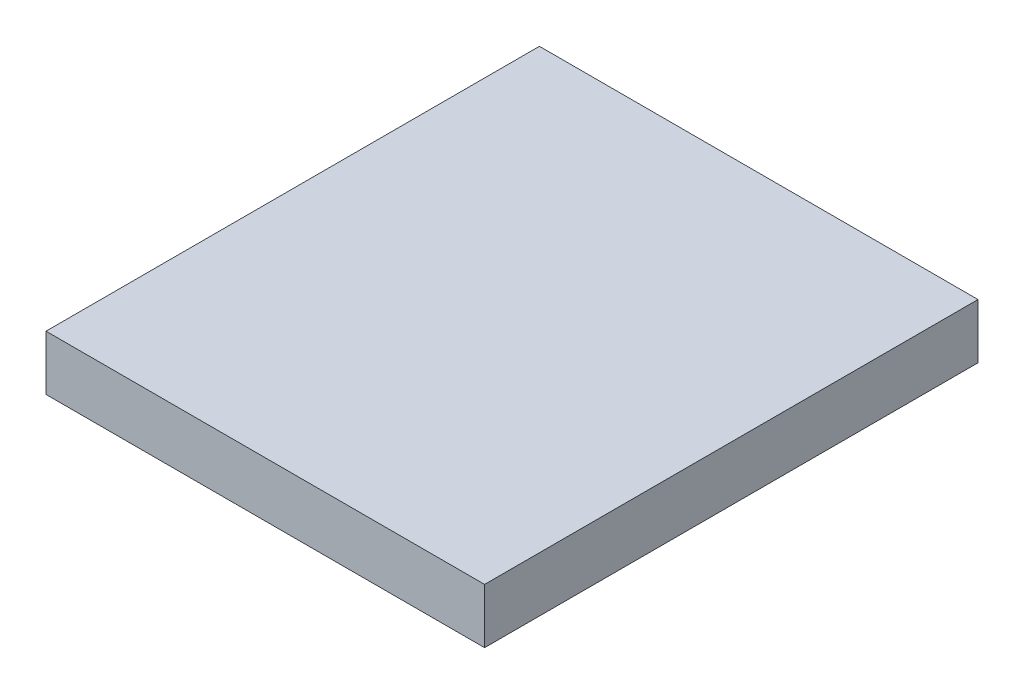
ISO-10303-21;
HEADER;
FILE_DESCRIPTION(('STEP AP214'),'2;1');
FILE_NAME('part.step','',(''),(''),'','','');
FILE_SCHEMA(('AUTOMOTIVE_DESIGN { 1 0 10303 214 1 1 1 1 }'));
ENDSEC;
DATA;
#1=APPLICATION_CONTEXT('core data for automotive mechanical design processes');
#2=APPLICATION_PROTOCOL_DEFINITION('international standard','automotive_design',2000,#1);
#3=PRODUCT_CONTEXT('',#1,'mechanical');
#4=PRODUCT('Part','Part','',(#3));
#5=PRODUCT_RELATED_PRODUCT_CATEGORY('part','',(#4));
#6=PRODUCT_DEFINITION_FORMATION('','',#4);
#7=PRODUCT_DEFINITION_CONTEXT('part definition',#1,'design');
#8=PRODUCT_DEFINITION('design','',#6,#7);
#9=PRODUCT_DEFINITION_SHAPE('','',#8);
#10=(LENGTH_UNIT() NAMED_UNIT(*) SI_UNIT(.MILLI.,.METRE.));
#11=(NAMED_UNIT(*) PLANE_ANGLE_UNIT() SI_UNIT($,.RADIAN.));
#12=(NAMED_UNIT(*) SI_UNIT($,.STERADIAN.) SOLID_ANGLE_UNIT());
#13=UNCERTAINTY_MEASURE_WITH_UNIT(LENGTH_MEASURE(1.E-05),#10,'distance_accuracy_value','');
#14=(GEOMETRIC_REPRESENTATION_CONTEXT(3) GLOBAL_UNCERTAINTY_ASSIGNED_CONTEXT((#13)) GLOBAL_UNIT_ASSIGNED_CONTEXT((#10,
#11,#12)) REPRESENTATION_CONTEXT('',''));
#15=CARTESIAN_POINT('',(0.,0.,0.));
#16=DIRECTION('',(0.,0.,1.));
#17=DIRECTION('',(1.,0.,0.));
#18=AXIS2_PLACEMENT_3D('',#15,#16,#17);
#19=CARTESIAN_POINT('',(8.,2.,-9.));
#20=DIRECTION('',(-1.,0.,0.));
#21=DIRECTION('',(0.,0.,1.));
#22=AXIS2_PLACEMENT_3D('',#19,#20,#21);
#23=PLANE('',#22);
#24=DIRECTION('',(0.,0.,-1.));
#25=VECTOR('',#24,1.);
#26=CARTESIAN_POINT('',(8.,0.,-9.));
#27=LINE('',#26,#25);
#28=CARTESIAN_POINT('',(8.,0.,9.));
#29=VERTEX_POINT('',#28);
#30=CARTESIAN_POINT('',(8.,0.,-9.));
#31=VERTEX_POINT('',#30);
#32=EDGE_CURVE('E96',#29,#31,#27,.T.);
#33=ORIENTED_EDGE('',*,*,#32,.T.);
#34=DIRECTION('',(0.,-1.,0.));
#35=VECTOR('',#34,1.);
#36=CARTESIAN_POINT('',(8.,2.,-9.));
#37=LINE('',#36,#35);
#38=CARTESIAN_POINT('',(8.,2.,-9.));
#39=VERTEX_POINT('',#38);
#40=EDGE_CURVE('E11',#39,#31,#37,.T.);
#41=ORIENTED_EDGE('',*,*,#40,.F.);
#42=DIRECTION('',(0.,0.,-1.));
#43=VECTOR('',#42,1.);
#44=CARTESIAN_POINT('',(8.,2.,-9.));
#45=LINE('',#44,#43);
#46=CARTESIAN_POINT('',(8.,2.,9.));
#47=VERTEX_POINT('',#46);
#48=EDGE_CURVE('E84',#47,#39,#45,.T.);
#49=ORIENTED_EDGE('',*,*,#48,.F.);
#50=DIRECTION('',(0.,-1.,0.));
#51=VECTOR('',#50,1.);
#52=CARTESIAN_POINT('',(8.,2.,9.));
#53=LINE('',#52,#51);
#54=EDGE_CURVE('E92',#47,#29,#53,.T.);
#55=ORIENTED_EDGE('',*,*,#54,.T.);
#56=EDGE_LOOP('',(#33,#41,#49,#55));
#57=FACE_BOUND('',#56,.T.);
#58=ADVANCED_FACE('F33',(#57),#23,.F.);
#59=CARTESIAN_POINT('',(-8.,2.,-9.));
#60=DIRECTION('',(0.,0.,1.));
#61=DIRECTION('',(1.,0.,0.));
#62=AXIS2_PLACEMENT_3D('',#59,#60,#61);
#63=PLANE('',#62);
#64=DIRECTION('',(-1.,0.,0.));
#65=VECTOR('',#64,1.);
#66=CARTESIAN_POINT('',(-8.,0.,-9.));
#67=LINE('',#66,#65);
#68=CARTESIAN_POINT('',(-8.,0.,-9.));
#69=VERTEX_POINT('',#68);
#70=EDGE_CURVE('E88',#31,#69,#67,.T.);
#71=ORIENTED_EDGE('',*,*,#70,.T.);
#72=DIRECTION('',(0.,-1.,0.));
#73=VECTOR('',#72,1.);
#74=CARTESIAN_POINT('',(-8.,2.,-9.));
#75=LINE('',#74,#73);
#76=CARTESIAN_POINT('',(-8.,2.,-9.));
#77=VERTEX_POINT('',#76);
#78=EDGE_CURVE('E41',#77,#69,#75,.T.);
#79=ORIENTED_EDGE('',*,*,#78,.F.);
#80=DIRECTION('',(-1.,0.,0.));
#81=VECTOR('',#80,1.);
#82=CARTESIAN_POINT('',(-8.,2.,-9.));
#83=LINE('',#82,#81);
#84=EDGE_CURVE('E79',#39,#77,#83,.T.);
#85=ORIENTED_EDGE('',*,*,#84,.F.);
#86=ORIENTED_EDGE('',*,*,#40,.T.);
#87=EDGE_LOOP('',(#71,#79,#85,#86));
#88=FACE_BOUND('',#87,.T.);
#89=ADVANCED_FACE('F87',(#88),#63,.F.);
#90=CARTESIAN_POINT('',(-8.,2.,-9.));
#91=DIRECTION('',(1.,0.,0.));
#92=DIRECTION('',(0.,0.,-1.));
#93=AXIS2_PLACEMENT_3D('',#90,#91,#92);
#94=PLANE('',#93);
#95=DIRECTION('',(0.,0.,1.));
#96=VECTOR('',#95,1.);
#97=CARTESIAN_POINT('',(-8.,0.,-9.));
#98=LINE('',#97,#96);
#99=CARTESIAN_POINT('',(-8.,0.,9.));
#100=VERTEX_POINT('',#99);
#101=EDGE_CURVE('E66',#69,#100,#98,.T.);
#102=ORIENTED_EDGE('',*,*,#101,.T.);
#103=DIRECTION('',(0.,-1.,0.));
#104=VECTOR('',#103,1.);
#105=CARTESIAN_POINT('',(-8.,2.,9.));
#106=LINE('',#105,#104);
#107=CARTESIAN_POINT('',(-8.,2.,9.));
#108=VERTEX_POINT('',#107);
#109=EDGE_CURVE('E89',#108,#100,#106,.T.);
#110=ORIENTED_EDGE('',*,*,#109,.F.);
#111=DIRECTION('',(0.,0.,1.));
#112=VECTOR('',#111,1.);
#113=CARTESIAN_POINT('',(-8.,2.,-9.));
#114=LINE('',#113,#112);
#115=EDGE_CURVE('E82',#77,#108,#114,.T.);
#116=ORIENTED_EDGE('',*,*,#115,.F.);
#117=ORIENTED_EDGE('',*,*,#78,.T.);
#118=EDGE_LOOP('',(#102,#110,#116,#117));
#119=FACE_BOUND('',#118,.T.);
#120=ADVANCED_FACE('F90',(#119),#94,.F.);
#121=CARTESIAN_POINT('',(-8.,2.,9.));
#122=DIRECTION('',(0.,0.,-1.));
#123=DIRECTION('',(-1.,0.,0.));
#124=AXIS2_PLACEMENT_3D('',#121,#122,#123);
#125=PLANE('',#124);
#126=DIRECTION('',(1.,0.,0.));
#127=VECTOR('',#126,1.);
#128=CARTESIAN_POINT('',(-8.,0.,9.));
#129=LINE('',#128,#127);
#130=EDGE_CURVE('E72',#100,#29,#129,.T.);
#131=ORIENTED_EDGE('',*,*,#130,.T.);
#132=ORIENTED_EDGE('',*,*,#54,.F.);
#133=DIRECTION('',(1.,0.,0.));
#134=VECTOR('',#133,1.);
#135=CARTESIAN_POINT('',(-8.,2.,9.));
#136=LINE('',#135,#134);
#137=EDGE_CURVE('E49',#108,#47,#136,.T.);
#138=ORIENTED_EDGE('',*,*,#137,.F.);
#139=ORIENTED_EDGE('',*,*,#109,.T.);
#140=EDGE_LOOP('',(#131,#132,#138,#139));
#141=FACE_BOUND('',#140,.T.);
#142=ADVANCED_FACE('F103',(#141),#125,.F.);
#143=CARTESIAN_POINT('',(0.,2.,0.));
#144=DIRECTION('',(0.,1.,0.));
#145=DIRECTION('',(0.,0.,1.));
#146=AXIS2_PLACEMENT_3D('',#143,#144,#145);
#147=PLANE('',#146);
#148=ORIENTED_EDGE('',*,*,#48,.T.);
#149=ORIENTED_EDGE('',*,*,#84,.T.);
#150=ORIENTED_EDGE('',*,*,#115,.T.);
#151=ORIENTED_EDGE('',*,*,#137,.T.);
#152=EDGE_LOOP('',(#148,#149,#150,#151));
#153=FACE_BOUND('',#152,.T.);
#154=ADVANCED_FACE('F80',(#153),#147,.T.);
#155=CARTESIAN_POINT('',(0.,0.,0.));
#156=DIRECTION('',(0.,1.,0.));
#157=DIRECTION('',(0.,0.,1.));
#158=AXIS2_PLACEMENT_3D('',#155,#156,#157);
#159=PLANE('',#158);
#160=ORIENTED_EDGE('',*,*,#32,.F.);
#161=ORIENTED_EDGE('',*,*,#130,.F.);
#162=ORIENTED_EDGE('',*,*,#101,.F.);
#163=ORIENTED_EDGE('',*,*,#70,.F.);
#164=EDGE_LOOP('',(#160,#161,#162,#163));
#165=FACE_BOUND('',#164,.T.);
#166=ADVANCED_FACE('F106',(#165),#159,.F.);
#167=CLOSED_SHELL('',(#58,#89,#120,#142,#154,#166));
#168=MANIFOLD_SOLID_BREP('B2',#167);
#169=ADVANCED_BREP_SHAPE_REPRESENTATION('',(#18,#168),#14);
#170=SHAPE_DEFINITION_REPRESENTATION(#9,#169);
ENDSEC;
END-ISO-10303-21;
